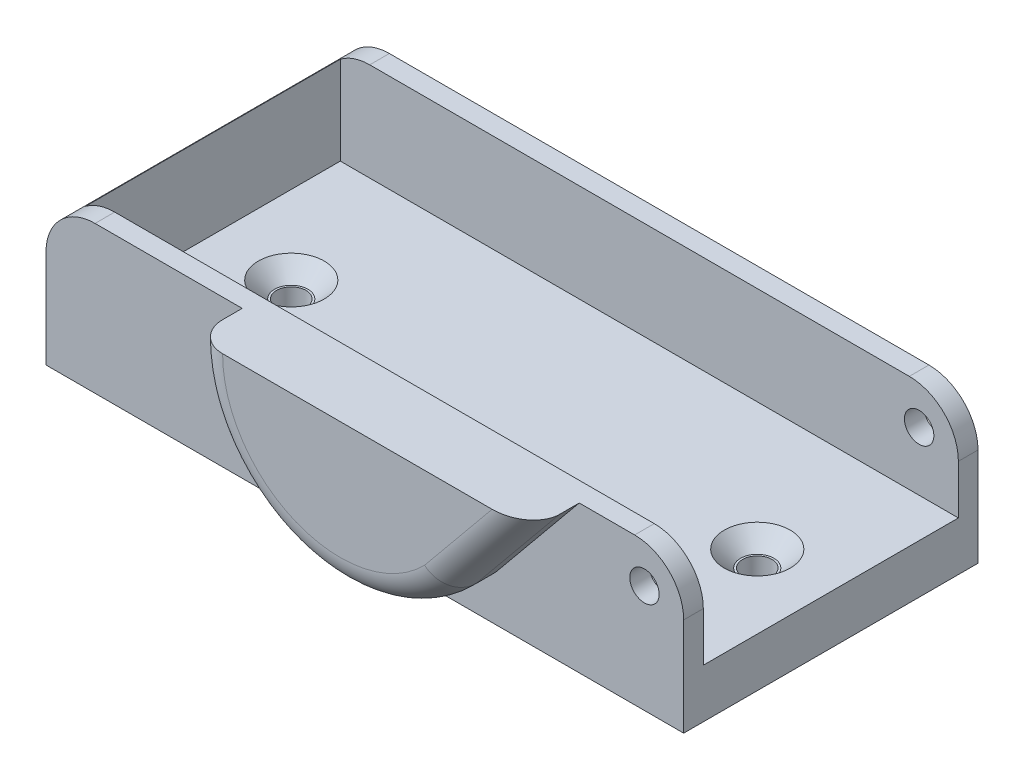
ISO-10303-21;
HEADER;
FILE_DESCRIPTION(('STEP AP214'),'2;1');
FILE_NAME('part.step','',(''),(''),'','','');
FILE_SCHEMA(('AUTOMOTIVE_DESIGN { 1 0 10303 214 1 1 1 1 }'));
ENDSEC;
DATA;
#1=APPLICATION_CONTEXT('core data for automotive mechanical design processes');
#2=APPLICATION_PROTOCOL_DEFINITION('international standard','automotive_design',2000,#1);
#3=PRODUCT_CONTEXT('',#1,'mechanical');
#4=PRODUCT('Part','Part','',(#3));
#5=PRODUCT_RELATED_PRODUCT_CATEGORY('part','',(#4));
#6=PRODUCT_DEFINITION_FORMATION('','',#4);
#7=PRODUCT_DEFINITION_CONTEXT('part definition',#1,'design');
#8=PRODUCT_DEFINITION('design','',#6,#7);
#9=PRODUCT_DEFINITION_SHAPE('','',#8);
#10=(LENGTH_UNIT() NAMED_UNIT(*) SI_UNIT(.MILLI.,.METRE.));
#11=(NAMED_UNIT(*) PLANE_ANGLE_UNIT() SI_UNIT($,.RADIAN.));
#12=(NAMED_UNIT(*) SI_UNIT($,.STERADIAN.) SOLID_ANGLE_UNIT());
#13=UNCERTAINTY_MEASURE_WITH_UNIT(LENGTH_MEASURE(1.E-05),#10,'distance_accuracy_value','');
#14=(GEOMETRIC_REPRESENTATION_CONTEXT(3) GLOBAL_UNCERTAINTY_ASSIGNED_CONTEXT((#13)) GLOBAL_UNIT_ASSIGNED_CONTEXT((#10,
#11,#12)) REPRESENTATION_CONTEXT('',''));
#15=CARTESIAN_POINT('',(0.,0.,0.));
#16=DIRECTION('',(0.,0.,1.));
#17=DIRECTION('',(1.,0.,0.));
#18=AXIS2_PLACEMENT_3D('',#15,#16,#17);
#19=CARTESIAN_POINT('',(0.,5.,0.));
#20=DIRECTION('',(0.,0.,-1.));
#21=DIRECTION('',(-1.,0.,0.));
#22=AXIS2_PLACEMENT_3D('',#19,#20,#21);
#23=PLANE('',#22);
#24=CARTESIAN_POINT('',(61.,11.,0.));
#25=DIRECTION('',(0.,0.,1.));
#26=DIRECTION('',(1.,0.,0.));
#27=AXIS2_PLACEMENT_3D('',#24,#25,#26);
#28=CIRCLE('',#27,1.5);
#29=CARTESIAN_POINT('',(62.5,11.,0.));
#30=VERTEX_POINT('',#29);
#31=EDGE_CURVE('E219',#30,#30,#28,.T.);
#32=ORIENTED_EDGE('',*,*,#31,.F.);
#33=EDGE_LOOP('',(#32));
#34=FACE_BOUND('',#33,.T.);
#35=DIRECTION('',(1.,0.,0.));
#36=VECTOR('',#35,1.);
#37=CARTESIAN_POINT('',(0.,15.,0.));
#38=LINE('',#37,#36);
#39=CARTESIAN_POINT('',(54.3554384566648,15.,0.));
#40=VERTEX_POINT('',#39);
#41=CARTESIAN_POINT('',(60.,15.,0.));
#42=VERTEX_POINT('',#41);
#43=EDGE_CURVE('E178',#40,#42,#38,.T.);
#44=ORIENTED_EDGE('',*,*,#43,.F.);
#45=DIRECTION('',(-0.634714362744004,-0.772746839350685,0.));
#46=VECTOR('',#45,1.);
#47=CARTESIAN_POINT('',(25.1005775263033,-20.616968271913,0.));
#48=LINE('',#47,#46);
#49=CARTESIAN_POINT('',(45.8362603801018,4.62814091039435,0.));
#50=VERTEX_POINT('',#49);
#51=EDGE_CURVE('E166',#40,#50,#48,.T.);
#52=ORIENTED_EDGE('',*,*,#51,.T.);
#53=CARTESIAN_POINT('',(35.,15.,0.));
#54=DIRECTION('',(0.,0.,1.));
#55=DIRECTION('',(1.,0.,0.));
#56=AXIS2_PLACEMENT_3D('',#53,#54,#55);
#57=CIRCLE('',#56,15.);
#58=CARTESIAN_POINT('',(35.,0.,0.));
#59=VERTEX_POINT('',#58);
#60=EDGE_CURVE('E175',#59,#50,#57,.T.);
#61=ORIENTED_EDGE('',*,*,#60,.F.);
#62=DIRECTION('',(1.,0.,0.));
#63=VECTOR('',#62,1.);
#64=CARTESIAN_POINT('',(0.,0.,0.));
#65=LINE('',#64,#63);
#66=CARTESIAN_POINT('',(65.,0.,0.));
#67=VERTEX_POINT('',#66);
#68=EDGE_CURVE('E280',#59,#67,#65,.T.);
#69=ORIENTED_EDGE('',*,*,#68,.T.);
#70=DIRECTION('',(0.,-1.,0.));
#71=VECTOR('',#70,1.);
#72=CARTESIAN_POINT('',(65.,5.,0.));
#73=LINE('',#72,#71);
#74=CARTESIAN_POINT('',(65.,10.,0.));
#75=VERTEX_POINT('',#74);
#76=EDGE_CURVE('E258',#75,#67,#73,.T.);
#77=ORIENTED_EDGE('',*,*,#76,.F.);
#78=CARTESIAN_POINT('',(60.,10.,0.));
#79=DIRECTION('',(0.,0.,-1.));
#80=DIRECTION('',(-1.,0.,0.));
#81=AXIS2_PLACEMENT_3D('',#78,#79,#80);
#82=CIRCLE('',#81,5.);
#83=EDGE_CURVE('E235',#75,#42,#82,.F.);
#84=ORIENTED_EDGE('',*,*,#83,.T.);
#85=EDGE_LOOP('',(#44,#52,#61,#69,#77,#84));
#86=FACE_BOUND('',#85,.T.);
#87=ADVANCED_FACE('F37',(#34,#86),#23,.F.);
#88=CARTESIAN_POINT('',(0.,15.,0.));
#89=DIRECTION('',(0.,1.,0.));
#90=DIRECTION('',(0.,0.,1.));
#91=AXIS2_PLACEMENT_3D('',#88,#89,#90);
#92=PLANE('',#91);
#93=DIRECTION('',(1.,0.,0.));
#94=VECTOR('',#93,1.);
#95=CARTESIAN_POINT('',(0.,15.,-28.));
#96=LINE('',#95,#94);
#97=CARTESIAN_POINT('',(5.,15.,-28.));
#98=VERTEX_POINT('',#97);
#99=CARTESIAN_POINT('',(60.,15.,-28.));
#100=VERTEX_POINT('',#99);
#101=EDGE_CURVE('E308',#98,#100,#96,.T.);
#102=ORIENTED_EDGE('',*,*,#101,.T.);
#103=DIRECTION('',(0.,0.,-1.));
#104=VECTOR('',#103,1.);
#105=CARTESIAN_POINT('',(60.,15.,-30.));
#106=LINE('',#105,#104);
#107=CARTESIAN_POINT('',(60.,15.,-30.));
#108=VERTEX_POINT('',#107);
#109=EDGE_CURVE('E250',#100,#108,#106,.T.);
#110=ORIENTED_EDGE('',*,*,#109,.T.);
#111=DIRECTION('',(-1.,0.,0.));
#112=VECTOR('',#111,1.);
#113=CARTESIAN_POINT('',(0.,15.,-30.));
#114=LINE('',#113,#112);
#115=CARTESIAN_POINT('',(5.,15.,-30.));
#116=VERTEX_POINT('',#115);
#117=EDGE_CURVE('E305',#108,#116,#114,.T.);
#118=ORIENTED_EDGE('',*,*,#117,.T.);
#119=DIRECTION('',(0.,0.,1.));
#120=VECTOR('',#119,1.);
#121=CARTESIAN_POINT('',(5.,15.,0.));
#122=LINE('',#121,#120);
#123=EDGE_CURVE('E253',#116,#98,#122,.T.);
#124=ORIENTED_EDGE('',*,*,#123,.T.);
#125=EDGE_LOOP('',(#102,#110,#118,#124));
#126=FACE_BOUND('',#125,.T.);
#127=ADVANCED_FACE('F335',(#126),#92,.T.);
#128=CARTESIAN_POINT('',(0.,5.,0.));
#129=DIRECTION('',(0.,1.,0.));
#130=DIRECTION('',(0.,0.,1.));
#131=AXIS2_PLACEMENT_3D('',#128,#129,#130);
#132=PLANE('',#131);
#133=CARTESIAN_POINT('',(10.,5.,-15.));
#134=DIRECTION('',(0.,1.,0.));
#135=DIRECTION('',(0.,0.,1.));
#136=AXIS2_PLACEMENT_3D('',#133,#134,#135);
#137=CIRCLE('',#136,3.36);
#138=CARTESIAN_POINT('',(10.,5.,-11.64));
#139=VERTEX_POINT('',#138);
#140=EDGE_CURVE('E210',#139,#139,#137,.T.);
#141=ORIENTED_EDGE('',*,*,#140,.F.);
#142=EDGE_LOOP('',(#141));
#143=FACE_BOUND('',#142,.T.);
#144=CARTESIAN_POINT('',(57.5,5.,-15.));
#145=DIRECTION('',(0.,1.,0.));
#146=DIRECTION('',(0.,0.,1.));
#147=AXIS2_PLACEMENT_3D('',#144,#145,#146);
#148=CIRCLE('',#147,3.36);
#149=CARTESIAN_POINT('',(57.5,5.,-11.64));
#150=VERTEX_POINT('',#149);
#151=EDGE_CURVE('E215',#150,#150,#148,.T.);
#152=ORIENTED_EDGE('',*,*,#151,.F.);
#153=EDGE_LOOP('',(#152));
#154=FACE_BOUND('',#153,.T.);
#155=DIRECTION('',(0.,0.,1.));
#156=VECTOR('',#155,1.);
#157=CARTESIAN_POINT('',(2.,5.,0.));
#158=LINE('',#157,#156);
#159=CARTESIAN_POINT('',(2.,5.,-28.));
#160=VERTEX_POINT('',#159);
#161=CARTESIAN_POINT('',(2.,5.,-2.));
#162=VERTEX_POINT('',#161);
#163=EDGE_CURVE('E296',#160,#162,#158,.T.);
#164=ORIENTED_EDGE('',*,*,#163,.T.);
#165=DIRECTION('',(1.,0.,0.));
#166=VECTOR('',#165,1.);
#167=CARTESIAN_POINT('',(0.,5.,-2.));
#168=LINE('',#167,#166);
#169=CARTESIAN_POINT('',(65.,5.,-2.));
#170=VERTEX_POINT('',#169);
#171=EDGE_CURVE('E299',#162,#170,#168,.T.);
#172=ORIENTED_EDGE('',*,*,#171,.T.);
#173=DIRECTION('',(0.,0.,-1.));
#174=VECTOR('',#173,1.);
#175=CARTESIAN_POINT('',(65.,5.,0.));
#176=LINE('',#175,#174);
#177=CARTESIAN_POINT('',(65.,5.,-28.));
#178=VERTEX_POINT('',#177);
#179=EDGE_CURVE('E267',#170,#178,#176,.T.);
#180=ORIENTED_EDGE('',*,*,#179,.T.);
#181=DIRECTION('',(1.,0.,0.));
#182=VECTOR('',#181,1.);
#183=CARTESIAN_POINT('',(0.,5.,-28.));
#184=LINE('',#183,#182);
#185=EDGE_CURVE('E292',#160,#178,#184,.T.);
#186=ORIENTED_EDGE('',*,*,#185,.F.);
#187=EDGE_LOOP('',(#164,#172,#180,#186));
#188=FACE_BOUND('',#187,.T.);
#189=ADVANCED_FACE('F350',(#143,#154,#188),#132,.T.);
#190=CARTESIAN_POINT('',(20.,15.,0.));
#191=VERTEX_POINT('',#190);
#192=EDGE_CURVE('E180',#191,#59,#57,.T.);
#193=ORIENTED_EDGE('',*,*,#192,.F.);
#194=CARTESIAN_POINT('',(5.,15.,0.));
#195=VERTEX_POINT('',#194);
#196=EDGE_CURVE('E291',#195,#191,#38,.T.);
#197=ORIENTED_EDGE('',*,*,#196,.F.);
#198=CARTESIAN_POINT('',(5.,10.,0.));
#199=DIRECTION('',(0.,0.,-1.));
#200=DIRECTION('',(-1.,0.,0.));
#201=AXIS2_PLACEMENT_3D('',#198,#199,#200);
#202=CIRCLE('',#201,5.);
#203=CARTESIAN_POINT('',(0.,10.,0.));
#204=VERTEX_POINT('',#203);
#205=EDGE_CURVE('E237',#195,#204,#202,.F.);
#206=ORIENTED_EDGE('',*,*,#205,.T.);
#207=DIRECTION('',(0.,-1.,0.));
#208=VECTOR('',#207,1.);
#209=CARTESIAN_POINT('',(0.,5.,0.));
#210=LINE('',#209,#208);
#211=CARTESIAN_POINT('',(0.,0.,0.));
#212=VERTEX_POINT('',#211);
#213=EDGE_CURVE('E265',#204,#212,#210,.T.);
#214=ORIENTED_EDGE('',*,*,#213,.T.);
#215=EDGE_CURVE('E277',#212,#59,#65,.T.);
#216=ORIENTED_EDGE('',*,*,#215,.T.);
#217=EDGE_LOOP('',(#193,#197,#206,#214,#216));
#218=FACE_BOUND('',#217,.T.);
#219=ADVANCED_FACE('F355',(#218),#23,.F.);
#220=CARTESIAN_POINT('',(65.,5.,0.));
#221=DIRECTION('',(-1.,0.,0.));
#222=DIRECTION('',(0.,0.,1.));
#223=AXIS2_PLACEMENT_3D('',#220,#221,#222);
#224=PLANE('',#223);
#225=DIRECTION('',(0.,-1.,0.));
#226=VECTOR('',#225,1.);
#227=CARTESIAN_POINT('',(65.,15.,-2.));
#228=LINE('',#227,#226);
#229=CARTESIAN_POINT('',(65.,10.,-2.));
#230=VERTEX_POINT('',#229);
#231=EDGE_CURVE('E289',#230,#170,#228,.T.);
#232=ORIENTED_EDGE('',*,*,#231,.F.);
#233=DIRECTION('',(0.,0.,-1.));
#234=VECTOR('',#233,1.);
#235=CARTESIAN_POINT('',(65.,10.,0.));
#236=LINE('',#235,#234);
#237=EDGE_CURVE('E239',#230,#75,#236,.F.);
#238=ORIENTED_EDGE('',*,*,#237,.T.);
#239=ORIENTED_EDGE('',*,*,#76,.T.);
#240=DIRECTION('',(0.,0.,-1.));
#241=VECTOR('',#240,1.);
#242=CARTESIAN_POINT('',(65.,0.,0.));
#243=LINE('',#242,#241);
#244=CARTESIAN_POINT('',(65.,0.,-30.));
#245=VERTEX_POINT('',#244);
#246=EDGE_CURVE('E274',#67,#245,#243,.T.);
#247=ORIENTED_EDGE('',*,*,#246,.T.);
#248=DIRECTION('',(0.,-1.,0.));
#249=VECTOR('',#248,1.);
#250=CARTESIAN_POINT('',(65.,5.,-30.));
#251=LINE('',#250,#249);
#252=CARTESIAN_POINT('',(65.,10.,-30.));
#253=VERTEX_POINT('',#252);
#254=EDGE_CURVE('E261',#253,#245,#251,.T.);
#255=ORIENTED_EDGE('',*,*,#254,.F.);
#256=DIRECTION('',(0.,0.,-1.));
#257=VECTOR('',#256,1.);
#258=CARTESIAN_POINT('',(65.,10.,-28.));
#259=LINE('',#258,#257);
#260=CARTESIAN_POINT('',(65.,10.,-28.));
#261=VERTEX_POINT('',#260);
#262=EDGE_CURVE('E241',#253,#261,#259,.F.);
#263=ORIENTED_EDGE('',*,*,#262,.T.);
#264=DIRECTION('',(0.,-1.,0.));
#265=VECTOR('',#264,1.);
#266=CARTESIAN_POINT('',(65.,15.,-28.));
#267=LINE('',#266,#265);
#268=EDGE_CURVE('E287',#261,#178,#267,.T.);
#269=ORIENTED_EDGE('',*,*,#268,.T.);
#270=ORIENTED_EDGE('',*,*,#179,.F.);
#271=EDGE_LOOP('',(#232,#238,#239,#247,#255,#263,#269,#270));
#272=FACE_BOUND('',#271,.T.);
#273=ADVANCED_FACE('F361',(#272),#224,.F.);
#274=CARTESIAN_POINT('',(0.,5.,-30.));
#275=DIRECTION('',(0.,0.,-1.));
#276=DIRECTION('',(-1.,0.,0.));
#277=AXIS2_PLACEMENT_3D('',#274,#275,#276);
#278=PLANE('',#277);
#279=CARTESIAN_POINT('',(61.,11.,-30.));
#280=DIRECTION('',(0.,0.,-1.));
#281=DIRECTION('',(-1.,0.,0.));
#282=AXIS2_PLACEMENT_3D('',#279,#280,#281);
#283=CIRCLE('',#282,1.5);
#284=CARTESIAN_POINT('',(59.5,11.,-30.));
#285=VERTEX_POINT('',#284);
#286=EDGE_CURVE('E302',#285,#285,#283,.T.);
#287=ORIENTED_EDGE('',*,*,#286,.F.);
#288=EDGE_LOOP('',(#287));
#289=FACE_BOUND('',#288,.T.);
#290=ORIENTED_EDGE('',*,*,#117,.F.);
#291=CARTESIAN_POINT('',(60.,10.,-30.));
#292=DIRECTION('',(0.,0.,-1.));
#293=DIRECTION('',(-1.,0.,0.));
#294=AXIS2_PLACEMENT_3D('',#291,#292,#293);
#295=CIRCLE('',#294,5.);
#296=EDGE_CURVE('E231',#108,#253,#295,.T.);
#297=ORIENTED_EDGE('',*,*,#296,.T.);
#298=ORIENTED_EDGE('',*,*,#254,.T.);
#299=DIRECTION('',(1.,0.,0.));
#300=VECTOR('',#299,1.);
#301=CARTESIAN_POINT('',(0.,0.,-30.));
#302=LINE('',#301,#300);
#303=CARTESIAN_POINT('',(0.,0.,-30.));
#304=VERTEX_POINT('',#303);
#305=EDGE_CURVE('E271',#304,#245,#302,.T.);
#306=ORIENTED_EDGE('',*,*,#305,.F.);
#307=DIRECTION('',(0.,-1.,0.));
#308=VECTOR('',#307,1.);
#309=CARTESIAN_POINT('',(0.,5.,-30.));
#310=LINE('',#309,#308);
#311=CARTESIAN_POINT('',(0.,10.,-30.));
#312=VERTEX_POINT('',#311);
#313=EDGE_CURVE('E263',#312,#304,#310,.T.);
#314=ORIENTED_EDGE('',*,*,#313,.F.);
#315=CARTESIAN_POINT('',(5.,10.,-30.));
#316=DIRECTION('',(0.,0.,-1.));
#317=DIRECTION('',(-1.,0.,0.));
#318=AXIS2_PLACEMENT_3D('',#315,#316,#317);
#319=CIRCLE('',#318,5.);
#320=EDGE_CURVE('E233',#312,#116,#319,.T.);
#321=ORIENTED_EDGE('',*,*,#320,.T.);
#322=EDGE_LOOP('',(#290,#297,#298,#306,#314,#321));
#323=FACE_BOUND('',#322,.T.);
#324=ADVANCED_FACE('F367',(#289,#323),#278,.T.);
#325=CARTESIAN_POINT('',(0.,5.,0.));
#326=DIRECTION('',(-1.,0.,0.));
#327=DIRECTION('',(0.,0.,1.));
#328=AXIS2_PLACEMENT_3D('',#325,#326,#327);
#329=PLANE('',#328);
#330=ORIENTED_EDGE('',*,*,#213,.F.);
#331=DIRECTION('',(0.,0.,1.));
#332=VECTOR('',#331,1.);
#333=CARTESIAN_POINT('',(0.,10.,0.));
#334=LINE('',#333,#332);
#335=EDGE_CURVE('E185',#204,#312,#334,.F.);
#336=ORIENTED_EDGE('',*,*,#335,.T.);
#337=ORIENTED_EDGE('',*,*,#313,.T.);
#338=DIRECTION('',(0.,0.,-1.));
#339=VECTOR('',#338,1.);
#340=CARTESIAN_POINT('',(0.,0.,0.));
#341=LINE('',#340,#339);
#342=EDGE_CURVE('E268',#212,#304,#341,.T.);
#343=ORIENTED_EDGE('',*,*,#342,.F.);
#344=EDGE_LOOP('',(#330,#336,#337,#343));
#345=FACE_BOUND('',#344,.T.);
#346=ADVANCED_FACE('F386',(#345),#329,.T.);
#347=CARTESIAN_POINT('',(0.,0.,0.));
#348=DIRECTION('',(0.,1.,0.));
#349=DIRECTION('',(0.,0.,1.));
#350=AXIS2_PLACEMENT_3D('',#347,#348,#349);
#351=PLANE('',#350);
#352=CARTESIAN_POINT('',(57.5,0.,-15.));
#353=DIRECTION('',(0.,1.,0.));
#354=DIRECTION('',(0.,0.,1.));
#355=AXIS2_PLACEMENT_3D('',#352,#353,#354);
#356=CIRCLE('',#355,1.5);
#357=CARTESIAN_POINT('',(57.5,0.,-13.5));
#358=VERTEX_POINT('',#357);
#359=EDGE_CURVE('E216',#358,#358,#356,.T.);
#360=ORIENTED_EDGE('',*,*,#359,.T.);
#361=EDGE_LOOP('',(#360));
#362=FACE_BOUND('',#361,.T.);
#363=CARTESIAN_POINT('',(10.,0.,-15.));
#364=DIRECTION('',(0.,1.,0.));
#365=DIRECTION('',(0.,0.,1.));
#366=AXIS2_PLACEMENT_3D('',#363,#364,#365);
#367=CIRCLE('',#366,1.5);
#368=CARTESIAN_POINT('',(10.,0.,-13.5));
#369=VERTEX_POINT('',#368);
#370=EDGE_CURVE('E214',#369,#369,#367,.T.);
#371=ORIENTED_EDGE('',*,*,#370,.T.);
#372=EDGE_LOOP('',(#371));
#373=FACE_BOUND('',#372,.T.);
#374=ORIENTED_EDGE('',*,*,#215,.F.);
#375=ORIENTED_EDGE('',*,*,#342,.T.);
#376=ORIENTED_EDGE('',*,*,#305,.T.);
#377=ORIENTED_EDGE('',*,*,#246,.F.);
#378=ORIENTED_EDGE('',*,*,#68,.F.);
#379=EDGE_LOOP('',(#374,#375,#376,#377,#378));
#380=FACE_BOUND('',#379,.T.);
#381=ADVANCED_FACE('F390',(#362,#373,#380),#351,.F.);
#382=CARTESIAN_POINT('',(0.,15.,-2.));
#383=DIRECTION('',(0.,0.,-1.));
#384=DIRECTION('',(-1.,0.,0.));
#385=AXIS2_PLACEMENT_3D('',#382,#383,#384);
#386=PLANE('',#385);
#387=CARTESIAN_POINT('',(61.,11.,-2.));
#388=DIRECTION('',(0.,0.,-1.));
#389=DIRECTION('',(-1.,0.,0.));
#390=AXIS2_PLACEMENT_3D('',#387,#388,#389);
#391=CIRCLE('',#390,1.5);
#392=CARTESIAN_POINT('',(59.5,11.,-2.));
#393=VERTEX_POINT('',#392);
#394=EDGE_CURVE('E224',#393,#393,#391,.T.);
#395=ORIENTED_EDGE('',*,*,#394,.F.);
#396=EDGE_LOOP('',(#395));
#397=FACE_BOUND('',#396,.T.);
#398=DIRECTION('',(1.,0.,0.));
#399=VECTOR('',#398,1.);
#400=CARTESIAN_POINT('',(0.,15.,-2.));
#401=LINE('',#400,#399);
#402=CARTESIAN_POINT('',(5.,15.,-2.));
#403=VERTEX_POINT('',#402);
#404=CARTESIAN_POINT('',(60.,15.,-2.));
#405=VERTEX_POINT('',#404);
#406=EDGE_CURVE('E295',#403,#405,#401,.T.);
#407=ORIENTED_EDGE('',*,*,#406,.T.);
#408=CARTESIAN_POINT('',(60.,10.,-2.));
#409=DIRECTION('',(0.,0.,-1.));
#410=DIRECTION('',(-1.,0.,0.));
#411=AXIS2_PLACEMENT_3D('',#408,#409,#410);
#412=CIRCLE('',#411,5.);
#413=EDGE_CURVE('E243',#405,#230,#412,.T.);
#414=ORIENTED_EDGE('',*,*,#413,.T.);
#415=ORIENTED_EDGE('',*,*,#231,.T.);
#416=ORIENTED_EDGE('',*,*,#171,.F.);
#417=DIRECTION('',(0.,-1.,0.));
#418=VECTOR('',#417,1.);
#419=CARTESIAN_POINT('',(2.,15.,-2.));
#420=LINE('',#419,#418);
#421=CARTESIAN_POINT('',(2.,14.,-2.));
#422=VERTEX_POINT('',#421);
#423=EDGE_CURVE('E283',#422,#162,#420,.T.);
#424=ORIENTED_EDGE('',*,*,#423,.F.);
#425=CARTESIAN_POINT('',(5.,10.,-2.));
#426=DIRECTION('',(0.,0.,-1.));
#427=DIRECTION('',(-1.,0.,0.));
#428=AXIS2_PLACEMENT_3D('',#425,#426,#427);
#429=CIRCLE('',#428,5.);
#430=EDGE_CURVE('E245',#422,#403,#429,.T.);
#431=ORIENTED_EDGE('',*,*,#430,.T.);
#432=EDGE_LOOP('',(#407,#414,#415,#416,#424,#431));
#433=FACE_BOUND('',#432,.T.);
#434=ADVANCED_FACE('F400',(#397,#433),#386,.T.);
#435=CARTESIAN_POINT('',(2.,15.,0.));
#436=DIRECTION('',(1.,0.,0.));
#437=DIRECTION('',(0.,0.,-1.));
#438=AXIS2_PLACEMENT_3D('',#435,#436,#437);
#439=PLANE('',#438);
#440=DIRECTION('',(0.,-1.,0.));
#441=VECTOR('',#440,1.);
#442=CARTESIAN_POINT('',(2.,15.,-28.));
#443=LINE('',#442,#441);
#444=CARTESIAN_POINT('',(2.,14.,-28.));
#445=VERTEX_POINT('',#444);
#446=EDGE_CURVE('E285',#445,#160,#443,.T.);
#447=ORIENTED_EDGE('',*,*,#446,.F.);
#448=DIRECTION('',(0.,0.,1.));
#449=VECTOR('',#448,1.);
#450=CARTESIAN_POINT('',(2.,14.,-28.));
#451=LINE('',#450,#449);
#452=EDGE_CURVE('E188',#445,#422,#451,.T.);
#453=ORIENTED_EDGE('',*,*,#452,.T.);
#454=ORIENTED_EDGE('',*,*,#423,.T.);
#455=ORIENTED_EDGE('',*,*,#163,.F.);
#456=EDGE_LOOP('',(#447,#453,#454,#455));
#457=FACE_BOUND('',#456,.T.);
#458=ADVANCED_FACE('F345',(#457),#439,.T.);
#459=CARTESIAN_POINT('',(0.,15.,-28.));
#460=DIRECTION('',(0.,0.,-1.));
#461=DIRECTION('',(-1.,0.,0.));
#462=AXIS2_PLACEMENT_3D('',#459,#460,#461);
#463=PLANE('',#462);
#464=CARTESIAN_POINT('',(61.,11.,-28.));
#465=DIRECTION('',(0.,0.,-1.));
#466=DIRECTION('',(-1.,0.,0.));
#467=AXIS2_PLACEMENT_3D('',#464,#465,#466);
#468=CIRCLE('',#467,1.5);
#469=CARTESIAN_POINT('',(59.5,11.,-28.));
#470=VERTEX_POINT('',#469);
#471=EDGE_CURVE('E222',#470,#470,#468,.T.);
#472=ORIENTED_EDGE('',*,*,#471,.T.);
#473=EDGE_LOOP('',(#472));
#474=FACE_BOUND('',#473,.T.);
#475=ORIENTED_EDGE('',*,*,#268,.F.);
#476=CARTESIAN_POINT('',(60.,10.,-28.));
#477=DIRECTION('',(0.,0.,-1.));
#478=DIRECTION('',(-1.,0.,0.));
#479=AXIS2_PLACEMENT_3D('',#476,#477,#478);
#480=CIRCLE('',#479,5.);
#481=EDGE_CURVE('E227',#261,#100,#480,.F.);
#482=ORIENTED_EDGE('',*,*,#481,.T.);
#483=ORIENTED_EDGE('',*,*,#101,.F.);
#484=CARTESIAN_POINT('',(5.,10.,-28.));
#485=DIRECTION('',(0.,0.,-1.));
#486=DIRECTION('',(-1.,0.,0.));
#487=AXIS2_PLACEMENT_3D('',#484,#485,#486);
#488=CIRCLE('',#487,5.);
#489=EDGE_CURVE('E229',#98,#445,#488,.F.);
#490=ORIENTED_EDGE('',*,*,#489,.T.);
#491=ORIENTED_EDGE('',*,*,#446,.T.);
#492=ORIENTED_EDGE('',*,*,#185,.T.);
#493=EDGE_LOOP('',(#475,#482,#483,#490,#491,#492));
#494=FACE_BOUND('',#493,.T.);
#495=ADVANCED_FACE('F333',(#474,#494),#463,.F.);
#496=DIRECTION('',(-1.,0.,0.));
#497=VECTOR('',#496,1.);
#498=CARTESIAN_POINT('',(0.,15.,5.));
#499=LINE('',#498,#497);
#500=CARTESIAN_POINT('',(50.4731838200482,15.,5.));
#501=VERTEX_POINT('',#500);
#502=CARTESIAN_POINT('',(23.,15.,5.));
#503=VERTEX_POINT('',#502);
#504=EDGE_CURVE('E179',#501,#503,#499,.T.);
#505=ORIENTED_EDGE('',*,*,#504,.F.);
#506=CARTESIAN_POINT('',(50.4731838200482,15.,2.));
#507=DIRECTION('',(0.,1.,0.));
#508=DIRECTION('',(-1.,0.,0.));
#509=AXIS2_PLACEMENT_3D('',#506,#507,#508);
#510=ELLIPSE('',#509,3.88225463661658,3.);
#511=CARTESIAN_POINT('',(54.3554384566648,15.,2.));
#512=VERTEX_POINT('',#511);
#513=EDGE_CURVE('E51',#501,#512,#510,.T.);
#514=ORIENTED_EDGE('',*,*,#513,.T.);
#515=DIRECTION('',(0.,0.,-1.));
#516=VECTOR('',#515,1.);
#517=CARTESIAN_POINT('',(54.3554384566648,15.,5.));
#518=LINE('',#517,#516);
#519=EDGE_CURVE('E171',#512,#40,#518,.T.);
#520=ORIENTED_EDGE('',*,*,#519,.T.);
#521=ORIENTED_EDGE('',*,*,#43,.T.);
#522=DIRECTION('',(0.,0.,-1.));
#523=VECTOR('',#522,1.);
#524=CARTESIAN_POINT('',(60.,15.,-2.));
#525=LINE('',#524,#523);
#526=EDGE_CURVE('E247',#42,#405,#525,.T.);
#527=ORIENTED_EDGE('',*,*,#526,.T.);
#528=ORIENTED_EDGE('',*,*,#406,.F.);
#529=DIRECTION('',(0.,0.,1.));
#530=VECTOR('',#529,1.);
#531=CARTESIAN_POINT('',(5.,15.,0.));
#532=LINE('',#531,#530);
#533=EDGE_CURVE('E256',#403,#195,#532,.T.);
#534=ORIENTED_EDGE('',*,*,#533,.T.);
#535=ORIENTED_EDGE('',*,*,#196,.T.);
#536=DIRECTION('',(0.,0.,-1.));
#537=VECTOR('',#536,1.);
#538=CARTESIAN_POINT('',(20.,15.,5.));
#539=LINE('',#538,#537);
#540=CARTESIAN_POINT('',(20.,15.,2.));
#541=VERTEX_POINT('',#540);
#542=EDGE_CURVE('E170',#541,#191,#539,.T.);
#543=ORIENTED_EDGE('',*,*,#542,.F.);
#544=CARTESIAN_POINT('',(23.,15.,2.));
#545=DIRECTION('',(0.,1.,0.));
#546=DIRECTION('',(0.,0.,1.));
#547=AXIS2_PLACEMENT_3D('',#544,#545,#546);
#548=CIRCLE('',#547,3.);
#549=EDGE_CURVE('E198',#541,#503,#548,.T.);
#550=ORIENTED_EDGE('',*,*,#549,.T.);
#551=EDGE_LOOP('',(#505,#514,#520,#521,#527,#528,#534,#535,#543,#550));
#552=FACE_BOUND('',#551,.T.);
#553=ADVANCED_FACE('F330',(#552),#92,.T.);
#554=CARTESIAN_POINT('',(60.,10.,0.));
#555=DIRECTION('',(0.,0.,1.));
#556=DIRECTION('',(1.,0.,0.));
#557=AXIS2_PLACEMENT_3D('',#554,#555,#556);
#558=CYLINDRICAL_SURFACE('',#557,5.);
#559=ORIENTED_EDGE('',*,*,#83,.F.);
#560=ORIENTED_EDGE('',*,*,#237,.F.);
#561=ORIENTED_EDGE('',*,*,#413,.F.);
#562=ORIENTED_EDGE('',*,*,#526,.F.);
#563=EDGE_LOOP('',(#559,#560,#561,#562));
#564=FACE_BOUND('',#563,.T.);
#565=ADVANCED_FACE('F332',(#564),#558,.T.);
#566=CARTESIAN_POINT('',(60.,10.,0.));
#567=DIRECTION('',(0.,0.,1.));
#568=DIRECTION('',(1.,0.,0.));
#569=AXIS2_PLACEMENT_3D('',#566,#567,#568);
#570=CYLINDRICAL_SURFACE('',#569,5.);
#571=ORIENTED_EDGE('',*,*,#481,.F.);
#572=ORIENTED_EDGE('',*,*,#262,.F.);
#573=ORIENTED_EDGE('',*,*,#296,.F.);
#574=ORIENTED_EDGE('',*,*,#109,.F.);
#575=EDGE_LOOP('',(#571,#572,#573,#574));
#576=FACE_BOUND('',#575,.T.);
#577=ADVANCED_FACE('F341',(#576),#570,.T.);
#578=CARTESIAN_POINT('',(5.,10.,0.));
#579=DIRECTION('',(0.,0.,1.));
#580=DIRECTION('',(1.,0.,0.));
#581=AXIS2_PLACEMENT_3D('',#578,#579,#580);
#582=CYLINDRICAL_SURFACE('',#581,5.);
#583=ORIENTED_EDGE('',*,*,#320,.F.);
#584=ORIENTED_EDGE('',*,*,#335,.F.);
#585=ORIENTED_EDGE('',*,*,#205,.F.);
#586=ORIENTED_EDGE('',*,*,#533,.F.);
#587=ORIENTED_EDGE('',*,*,#430,.F.);
#588=ORIENTED_EDGE('',*,*,#452,.F.);
#589=ORIENTED_EDGE('',*,*,#489,.F.);
#590=ORIENTED_EDGE('',*,*,#123,.F.);
#591=EDGE_LOOP('',(#583,#584,#585,#586,#587,#588,#589,#590));
#592=FACE_BOUND('',#591,.T.);
#593=ADVANCED_FACE('F380',(#592),#582,.T.);
#594=CARTESIAN_POINT('',(61.,11.,-38.));
#595=DIRECTION('',(0.,0.,1.));
#596=DIRECTION('',(1.,0.,0.));
#597=AXIS2_PLACEMENT_3D('',#594,#595,#596);
#598=CYLINDRICAL_SURFACE('',#597,1.5);
#599=ORIENTED_EDGE('',*,*,#286,.T.);
#600=EDGE_LOOP('',(#599));
#601=FACE_BOUND('',#600,.T.);
#602=ORIENTED_EDGE('',*,*,#471,.F.);
#603=EDGE_LOOP('',(#602));
#604=FACE_BOUND('',#603,.T.);
#605=ADVANCED_FACE('F460',(#601,#604),#598,.F.);
#606=ORIENTED_EDGE('',*,*,#394,.T.);
#607=EDGE_LOOP('',(#606));
#608=FACE_BOUND('',#607,.T.);
#609=ORIENTED_EDGE('',*,*,#31,.T.);
#610=EDGE_LOOP('',(#609));
#611=FACE_BOUND('',#610,.T.);
#612=ADVANCED_FACE('F466',(#608,#611),#598,.F.);
#613=CARTESIAN_POINT('',(10.,-26.,-15.));
#614=DIRECTION('',(0.,1.,0.));
#615=DIRECTION('',(0.,0.,1.));
#616=AXIS2_PLACEMENT_3D('',#613,#614,#615);
#617=CYLINDRICAL_SURFACE('',#616,1.5);
#618=CARTESIAN_POINT('',(10.,3.34,-15.));
#619=DIRECTION('',(0.,-1.,0.));
#620=DIRECTION('',(0.,0.,-1.));
#621=AXIS2_PLACEMENT_3D('',#618,#619,#620);
#622=CIRCLE('',#621,1.5);
#623=CARTESIAN_POINT('',(10.,3.34,-16.5));
#624=VERTEX_POINT('',#623);
#625=EDGE_CURVE('E206',#624,#624,#622,.F.);
#626=ORIENTED_EDGE('',*,*,#625,.T.);
#627=EDGE_LOOP('',(#626));
#628=FACE_BOUND('',#627,.T.);
#629=ORIENTED_EDGE('',*,*,#370,.F.);
#630=EDGE_LOOP('',(#629));
#631=FACE_BOUND('',#630,.T.);
#632=ADVANCED_FACE('F473',(#628,#631),#617,.F.);
#633=CARTESIAN_POINT('',(57.5,-26.,-15.));
#634=DIRECTION('',(0.,1.,0.));
#635=DIRECTION('',(0.,0.,1.));
#636=AXIS2_PLACEMENT_3D('',#633,#634,#635);
#637=CYLINDRICAL_SURFACE('',#636,1.5);
#638=CARTESIAN_POINT('',(57.5,3.34,-15.));
#639=DIRECTION('',(0.,-1.,0.));
#640=DIRECTION('',(0.,0.,-1.));
#641=AXIS2_PLACEMENT_3D('',#638,#639,#640);
#642=CIRCLE('',#641,1.5);
#643=CARTESIAN_POINT('',(57.5,3.34,-16.5));
#644=VERTEX_POINT('',#643);
#645=EDGE_CURVE('E211',#644,#644,#642,.F.);
#646=ORIENTED_EDGE('',*,*,#645,.T.);
#647=EDGE_LOOP('',(#646));
#648=FACE_BOUND('',#647,.T.);
#649=ORIENTED_EDGE('',*,*,#359,.F.);
#650=EDGE_LOOP('',(#649));
#651=FACE_BOUND('',#650,.T.);
#652=ADVANCED_FACE('F480',(#648,#651),#637,.F.);
#653=CARTESIAN_POINT('',(59.2,3.34,-15.));
#654=DIRECTION('',(0.,-1.,0.));
#655=DIRECTION('',(0.,0.,-1.));
#656=AXIS2_PLACEMENT_3D('',#653,#654,#655);
#657=PLANE('',#656);
#658=CARTESIAN_POINT('',(57.5,3.34,-15.));
#659=DIRECTION('',(0.,1.,0.));
#660=DIRECTION('',(0.,0.,1.));
#661=AXIS2_PLACEMENT_3D('',#658,#659,#660);
#662=CIRCLE('',#661,1.7);
#663=CARTESIAN_POINT('',(57.5,3.34,-13.3));
#664=VERTEX_POINT('',#663);
#665=EDGE_CURVE('E209',#664,#664,#662,.T.);
#666=ORIENTED_EDGE('',*,*,#665,.T.);
#667=EDGE_LOOP('',(#666));
#668=FACE_BOUND('',#667,.T.);
#669=ORIENTED_EDGE('',*,*,#645,.F.);
#670=EDGE_LOOP('',(#669));
#671=FACE_BOUND('',#670,.T.);
#672=ADVANCED_FACE('F488',(#668,#671),#657,.F.);
#673=CARTESIAN_POINT('',(57.5,5.,-15.));
#674=DIRECTION('',(0.,1.,0.));
#675=DIRECTION('',(0.,0.,1.));
#676=AXIS2_PLACEMENT_3D('',#673,#674,#675);
#677=CONICAL_SURFACE('',#676,3.36,0.785398163397449);
#678=ORIENTED_EDGE('',*,*,#665,.F.);
#679=EDGE_LOOP('',(#678));
#680=FACE_BOUND('',#679,.T.);
#681=ORIENTED_EDGE('',*,*,#151,.T.);
#682=EDGE_LOOP('',(#681));
#683=FACE_BOUND('',#682,.T.);
#684=ADVANCED_FACE('F496',(#680,#683),#677,.F.);
#685=CARTESIAN_POINT('',(11.7,3.34,-15.));
#686=DIRECTION('',(0.,-1.,0.));
#687=DIRECTION('',(0.,0.,-1.));
#688=AXIS2_PLACEMENT_3D('',#685,#686,#687);
#689=PLANE('',#688);
#690=CARTESIAN_POINT('',(10.,3.34,-15.));
#691=DIRECTION('',(0.,1.,0.));
#692=DIRECTION('',(0.,0.,1.));
#693=AXIS2_PLACEMENT_3D('',#690,#691,#692);
#694=CIRCLE('',#693,1.7);
#695=CARTESIAN_POINT('',(10.,3.34,-13.3));
#696=VERTEX_POINT('',#695);
#697=EDGE_CURVE('E325',#696,#696,#694,.T.);
#698=ORIENTED_EDGE('',*,*,#697,.T.);
#699=EDGE_LOOP('',(#698));
#700=FACE_BOUND('',#699,.T.);
#701=ORIENTED_EDGE('',*,*,#625,.F.);
#702=EDGE_LOOP('',(#701));
#703=FACE_BOUND('',#702,.T.);
#704=ADVANCED_FACE('F504',(#700,#703),#689,.F.);
#705=CARTESIAN_POINT('',(10.,5.,-15.));
#706=DIRECTION('',(0.,1.,0.));
#707=DIRECTION('',(0.,0.,1.));
#708=AXIS2_PLACEMENT_3D('',#705,#706,#707);
#709=CONICAL_SURFACE('',#708,3.36,0.785398163397448);
#710=ORIENTED_EDGE('',*,*,#697,.F.);
#711=EDGE_LOOP('',(#710));
#712=FACE_BOUND('',#711,.T.);
#713=ORIENTED_EDGE('',*,*,#140,.T.);
#714=EDGE_LOOP('',(#713));
#715=FACE_BOUND('',#714,.T.);
#716=ADVANCED_FACE('F512',(#712,#715),#709,.F.);
#717=CARTESIAN_POINT('',(35.,15.,5.));
#718=DIRECTION('',(0.,0.,-1.));
#719=DIRECTION('',(-1.,0.,0.));
#720=AXIS2_PLACEMENT_3D('',#717,#718,#719);
#721=CYLINDRICAL_SURFACE('',#720,15.);
#722=DIRECTION('',(0.,0.,-1.));
#723=VECTOR('',#722,1.);
#724=CARTESIAN_POINT('',(45.8362603801018,4.62814091039435,5.));
#725=LINE('',#724,#723);
#726=CARTESIAN_POINT('',(45.8362603801018,4.62814091039435,2.));
#727=VERTEX_POINT('',#726);
#728=EDGE_CURVE('E162',#727,#50,#725,.T.);
#729=ORIENTED_EDGE('',*,*,#728,.F.);
#730=CARTESIAN_POINT('',(35.,15.,2.));
#731=DIRECTION('',(0.,0.,1.));
#732=DIRECTION('',(1.,0.,0.));
#733=AXIS2_PLACEMENT_3D('',#730,#731,#732);
#734=CIRCLE('',#733,15.);
#735=EDGE_CURVE('E11',#727,#541,#734,.F.);
#736=ORIENTED_EDGE('',*,*,#735,.T.);
#737=ORIENTED_EDGE('',*,*,#542,.T.);
#738=ORIENTED_EDGE('',*,*,#192,.T.);
#739=ORIENTED_EDGE('',*,*,#60,.T.);
#740=EDGE_LOOP('',(#729,#736,#737,#738,#739));
#741=FACE_BOUND('',#740,.T.);
#742=ADVANCED_FACE('F183',(#741),#721,.T.);
#743=CARTESIAN_POINT('',(25.1005775263033,-20.616968271913,5.));
#744=DIRECTION('',(0.772746839350685,-0.634714362744004,0.));
#745=DIRECTION('',(0.634714362744004,0.772746839350685,0.));
#746=AXIS2_PLACEMENT_3D('',#743,#744,#745);
#747=PLANE('',#746);
#748=ORIENTED_EDGE('',*,*,#519,.F.);
#749=DIRECTION('',(-0.634714362744004,-0.772746839350685,0.));
#750=VECTOR('',#749,1.);
#751=CARTESIAN_POINT('',(25.1005775263033,-20.616968271913,2.));
#752=LINE('',#751,#750);
#753=EDGE_CURVE('E168',#512,#727,#752,.T.);
#754=ORIENTED_EDGE('',*,*,#753,.T.);
#755=ORIENTED_EDGE('',*,*,#728,.T.);
#756=ORIENTED_EDGE('',*,*,#51,.F.);
#757=EDGE_LOOP('',(#748,#754,#755,#756));
#758=FACE_BOUND('',#757,.T.);
#759=ADVANCED_FACE('F165',(#758),#747,.T.);
#760=CARTESIAN_POINT('',(0.,0.,5.));
#761=DIRECTION('',(0.,0.,1.));
#762=DIRECTION('',(1.,0.,0.));
#763=AXIS2_PLACEMENT_3D('',#760,#761,#762);
#764=PLANE('',#763);
#765=CARTESIAN_POINT('',(35.,15.,5.));
#766=DIRECTION('',(0.,0.,1.));
#767=DIRECTION('',(1.,0.,0.));
#768=AXIS2_PLACEMENT_3D('',#765,#766,#767);
#769=CIRCLE('',#768,12.);
#770=CARTESIAN_POINT('',(43.5943175349924,6.62517426403854,5.));
#771=VERTEX_POINT('',#770);
#772=EDGE_CURVE('E64',#503,#771,#769,.T.);
#773=ORIENTED_EDGE('',*,*,#772,.T.);
#774=DIRECTION('',(-0.634714362744004,-0.772746839350685,0.));
#775=VECTOR('',#774,1.);
#776=CARTESIAN_POINT('',(22.7823370082513,-18.7128251836809,5.));
#777=LINE('',#776,#775);
#778=EDGE_CURVE('E194',#771,#501,#777,.F.);
#779=ORIENTED_EDGE('',*,*,#778,.T.);
#780=ORIENTED_EDGE('',*,*,#504,.T.);
#781=EDGE_LOOP('',(#773,#779,#780));
#782=FACE_BOUND('',#781,.T.);
#783=ADVANCED_FACE('F329',(#782),#764,.T.);
#784=CARTESIAN_POINT('',(35.,15.,2.));
#785=DIRECTION('',(0.,0.,1.));
#786=DIRECTION('',(1.,0.,0.));
#787=AXIS2_PLACEMENT_3D('',#784,#785,#786);
#788=TOROIDAL_SURFACE('',#787,12.,3.);
#789=ORIENTED_EDGE('',*,*,#549,.F.);
#790=ORIENTED_EDGE('',*,*,#735,.F.);
#791=CARTESIAN_POINT('',(45.8362603801018,4.62814091039435,2.));
#792=CARTESIAN_POINT('',(45.8362665206068,4.62813559959863,2.08433156696183));
#793=CARTESIAN_POINT('',(45.8335982443622,4.63050215947265,2.16865928254464));
#794=CARTESIAN_POINT('',(45.8229603391414,4.63993788797231,2.33671110297656));
#795=CARTESIAN_POINT('',(45.8149909707126,4.64700682547726,2.42043523728712));
#796=CARTESIAN_POINT('',(45.7938058549773,4.66579952957005,2.58663354084005));
#797=CARTESIAN_POINT('',(45.780593825899,4.67751999717545,2.66910855304614));
#798=CARTESIAN_POINT('',(45.7490319110604,4.70552144368001,2.83225735926766));
#799=CARTESIAN_POINT('',(45.7306820866163,4.72180236815318,2.91293117476676));
#800=CARTESIAN_POINT('',(45.6680771654974,4.77735533347117,3.15147082346689));
#801=CARTESIAN_POINT('',(45.6162577190966,4.82334545902758,3.30592430312515));
#802=CARTESIAN_POINT('',(45.4940232755037,4.93187009566009,3.60088966641342));
#803=CARTESIAN_POINT('',(45.4236125460408,4.99440080976111,3.74140473950868));
#804=CARTESIAN_POINT('',(45.2661712705906,5.13428894200385,4.00470157291877));
#805=CARTESIAN_POINT('',(45.1791365456517,5.21165008824806,4.12747886063701));
#806=CARTESIAN_POINT('',(44.9909227401814,5.37904125539868,4.35179185097557));
#807=CARTESIAN_POINT('',(44.8897390240022,5.46907542844527,4.45332056457621));
#808=CARTESIAN_POINT('',(44.6760594075489,5.65933697364933,4.63230783452103));
#809=CARTESIAN_POINT('',(44.5635528602388,5.75957394068115,4.70974345052269));
#810=CARTESIAN_POINT('',(44.330554086247,5.96732019517766,4.83817790603988));
#811=CARTESIAN_POINT('',(44.2100686745431,6.07482327802356,4.88919898669532));
#812=CARTESIAN_POINT('',(44.0110144662042,6.25257669472968,4.94942790584345));
#813=CARTESIAN_POINT('',(43.9337860216801,6.32157549633504,4.96714901339602));
#814=CARTESIAN_POINT('',(43.7784838888914,6.46040283912396,4.99165208883551));
#815=CARTESIAN_POINT('',(43.7004117240731,6.53022990171825,4.9984512480327));
#816=CARTESIAN_POINT('',(43.6130128995687,6.60844227839703,4.99992163190175));
#817=CARTESIAN_POINT('',(43.6036646267488,6.61680851797172,5.00000020580361));
#818=CARTESIAN_POINT('',(43.5943175349924,6.62517426403858,5.));
#819=B_SPLINE_CURVE_WITH_KNOTS('',3,(#791,#792,#793,#794,#795,#796,#797,#798,#799,#800,#801,
#802,#803,#804,#805,#806,#807,#808,#809,#810,#811,#812,#813,#814,#815,#816,#817,#818),
.UNSPECIFIED.,.F.,.F.,(4,2,2,2,2,2,2,2,2,2,2,2,2,4),(0.,0.252912367215347,0.50581230476892,
0.758533198922363,1.01125107714947,1.51647812845996,2.02158930286244,2.52682761998129,
3.03223185835928,3.53811585714076,4.04357320404244,4.35828276543706,4.67249648216559,
4.71013191420969),.UNSPECIFIED.);
#820=EDGE_CURVE('E42',#771,#727,#819,.F.);
#821=ORIENTED_EDGE('',*,*,#820,.F.);
#822=ORIENTED_EDGE('',*,*,#772,.F.);
#823=EDGE_LOOP('',(#789,#790,#821,#822));
#824=FACE_BOUND('',#823,.T.);
#825=ADVANCED_FACE('F197',(#824),#788,.T.);
#826=CARTESIAN_POINT('',(22.7823370082513,-18.7128251836809,2.));
#827=DIRECTION('',(-0.634714362744004,-0.772746839350685,0.));
#828=DIRECTION('',(0.772746839350685,-0.634714362744004,0.));
#829=AXIS2_PLACEMENT_3D('',#826,#827,#828);
#830=CYLINDRICAL_SURFACE('',#829,3.);
#831=ORIENTED_EDGE('',*,*,#513,.F.);
#832=ORIENTED_EDGE('',*,*,#778,.F.);
#833=ORIENTED_EDGE('',*,*,#820,.T.);
#834=ORIENTED_EDGE('',*,*,#753,.F.);
#835=EDGE_LOOP('',(#831,#832,#833,#834));
#836=FACE_BOUND('',#835,.T.);
#837=ADVANCED_FACE('F39',(#836),#830,.T.);
#838=CLOSED_SHELL('',(#87,#127,#189,#219,#273,#324,#346,#381,#434,#458,#495,#553,#565,#577,#593,
#605,#612,#632,#652,#672,#684,#704,#716,#742,#759,#783,#825,#837));
#839=MANIFOLD_SOLID_BREP('B2',#838);
#840=ADVANCED_BREP_SHAPE_REPRESENTATION('',(#18,#839),#14);
#841=SHAPE_DEFINITION_REPRESENTATION(#9,#840);
ENDSEC;
END-ISO-10303-21;
